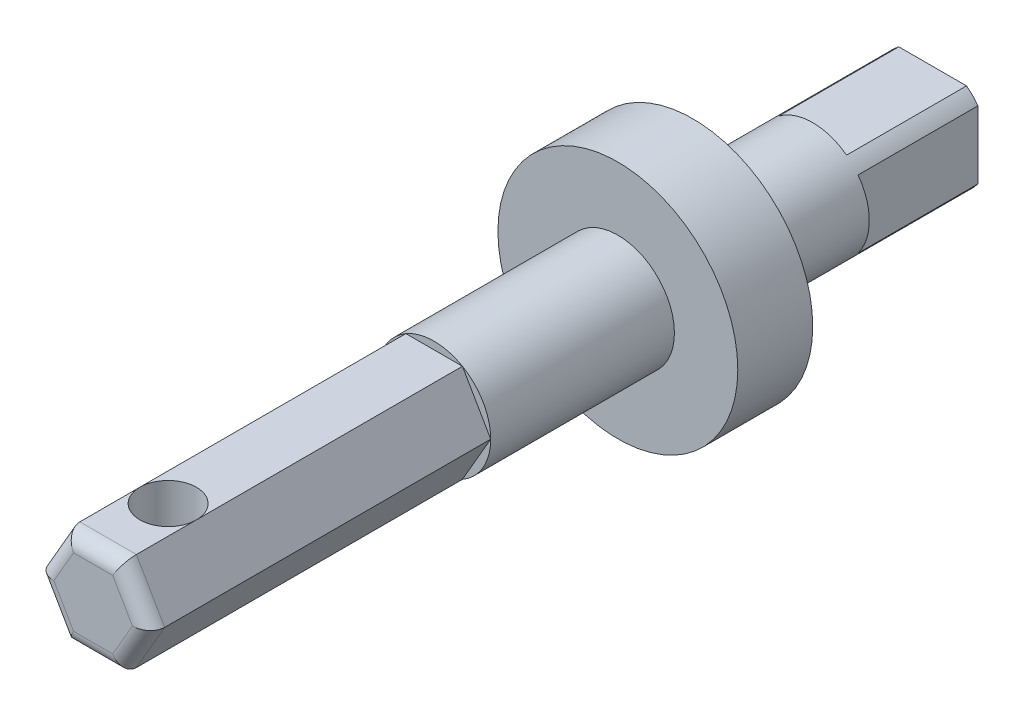
ISO-10303-21;
HEADER;
FILE_DESCRIPTION(('STEP AP214'),'2;1');
FILE_NAME('part.step','',(''),(''),'','','');
FILE_SCHEMA(('AUTOMOTIVE_DESIGN { 1 0 10303 214 1 1 1 1 }'));
ENDSEC;
DATA;
#1=APPLICATION_CONTEXT('core data for automotive mechanical design processes');
#2=APPLICATION_PROTOCOL_DEFINITION('international standard','automotive_design',2000,#1);
#3=PRODUCT_CONTEXT('',#1,'mechanical');
#4=PRODUCT('Part','Part','',(#3));
#5=PRODUCT_RELATED_PRODUCT_CATEGORY('part','',(#4));
#6=PRODUCT_DEFINITION_FORMATION('','',#4);
#7=PRODUCT_DEFINITION_CONTEXT('part definition',#1,'design');
#8=PRODUCT_DEFINITION('design','',#6,#7);
#9=PRODUCT_DEFINITION_SHAPE('','',#8);
#10=(LENGTH_UNIT() NAMED_UNIT(*) SI_UNIT(.MILLI.,.METRE.));
#11=(NAMED_UNIT(*) PLANE_ANGLE_UNIT() SI_UNIT($,.RADIAN.));
#12=(NAMED_UNIT(*) SI_UNIT($,.STERADIAN.) SOLID_ANGLE_UNIT());
#13=UNCERTAINTY_MEASURE_WITH_UNIT(LENGTH_MEASURE(1.E-05),#10,'distance_accuracy_value','');
#14=(GEOMETRIC_REPRESENTATION_CONTEXT(3) GLOBAL_UNCERTAINTY_ASSIGNED_CONTEXT((#13)) GLOBAL_UNIT_ASSIGNED_CONTEXT((#10,
#11,#12)) REPRESENTATION_CONTEXT('',''));
#15=CARTESIAN_POINT('',(0.,0.,0.));
#16=DIRECTION('',(0.,0.,1.));
#17=DIRECTION('',(1.,0.,0.));
#18=AXIS2_PLACEMENT_3D('',#15,#16,#17);
#19=CARTESIAN_POINT('',(1.8865,3.26751384847869,46.));
#20=DIRECTION('',(0.,-1.,0.));
#21=DIRECTION('',(1.,0.,0.));
#22=AXIS2_PLACEMENT_3D('',#19,#20,#21);
#23=PLANE('',#22);
#24=DIRECTION('',(0.,0.,-1.));
#25=VECTOR('',#24,1.);
#26=CARTESIAN_POINT('',(-1.8865,3.26751384847869,46.));
#27=LINE('',#26,#25);
#28=CARTESIAN_POINT('',(-1.8865,3.26751384847869,55.));
#29=VERTEX_POINT('',#28);
#30=CARTESIAN_POINT('',(-1.8865,3.26751384847869,51.));
#31=VERTEX_POINT('',#30);
#32=EDGE_CURVE('E176',#29,#31,#27,.T.);
#33=ORIENTED_EDGE('',*,*,#32,.F.);
#34=DIRECTION('',(-1.,0.,0.));
#35=VECTOR('',#34,1.);
#36=CARTESIAN_POINT('',(1.8865,3.26751384847869,55.));
#37=LINE('',#36,#35);
#38=CARTESIAN_POINT('',(1.8865,3.26751384847869,55.));
#39=VERTEX_POINT('',#38);
#40=EDGE_CURVE('E70',#29,#39,#37,.F.);
#41=ORIENTED_EDGE('',*,*,#40,.T.);
#42=DIRECTION('',(0.,0.,-1.));
#43=VECTOR('',#42,1.);
#44=CARTESIAN_POINT('',(1.8865,3.26751384847869,46.));
#45=LINE('',#44,#43);
#46=CARTESIAN_POINT('',(1.8865,3.26751384847869,51.));
#47=VERTEX_POINT('',#46);
#48=EDGE_CURVE('E201',#39,#47,#45,.T.);
#49=ORIENTED_EDGE('',*,*,#48,.T.);
#50=CARTESIAN_POINT('',(0.,3.26751384847869,51.));
#51=DIRECTION('',(0.,1.,0.));
#52=DIRECTION('',(-1.,0.,0.));
#53=AXIS2_PLACEMENT_3D('',#50,#51,#52);
#54=CIRCLE('',#53,1.8865);
#55=EDGE_CURVE('E196',#31,#47,#54,.T.);
#56=ORIENTED_EDGE('',*,*,#55,.F.);
#57=EDGE_LOOP('',(#33,#41,#49,#56));
#58=FACE_BOUND('',#57,.T.);
#59=ADVANCED_FACE('F45',(#58),#23,.F.);
#60=CARTESIAN_POINT('',(-1.8865,-3.26751384847869,46.));
#61=DIRECTION('',(0.,1.,0.));
#62=DIRECTION('',(-1.,0.,0.));
#63=AXIS2_PLACEMENT_3D('',#60,#61,#62);
#64=PLANE('',#63);
#65=DIRECTION('',(0.,0.,-1.));
#66=VECTOR('',#65,1.);
#67=CARTESIAN_POINT('',(1.8865,-3.26751384847869,46.));
#68=LINE('',#67,#66);
#69=CARTESIAN_POINT('',(1.8865,-3.26751384847869,55.));
#70=VERTEX_POINT('',#69);
#71=CARTESIAN_POINT('',(1.8865,-3.26751384847869,51.));
#72=VERTEX_POINT('',#71);
#73=EDGE_CURVE('E384',#70,#72,#68,.T.);
#74=ORIENTED_EDGE('',*,*,#73,.F.);
#75=DIRECTION('',(1.,0.,0.));
#76=VECTOR('',#75,1.);
#77=CARTESIAN_POINT('',(-1.8865,-3.26751384847869,55.));
#78=LINE('',#77,#76);
#79=CARTESIAN_POINT('',(-1.8865,-3.26751384847869,55.));
#80=VERTEX_POINT('',#79);
#81=EDGE_CURVE('E333',#70,#80,#78,.F.);
#82=ORIENTED_EDGE('',*,*,#81,.T.);
#83=DIRECTION('',(0.,0.,-1.));
#84=VECTOR('',#83,1.);
#85=CARTESIAN_POINT('',(-1.8865,-3.26751384847869,46.));
#86=LINE('',#85,#84);
#87=CARTESIAN_POINT('',(-1.8865,-3.26751384847869,51.));
#88=VERTEX_POINT('',#87);
#89=EDGE_CURVE('E211',#80,#88,#86,.T.);
#90=ORIENTED_EDGE('',*,*,#89,.T.);
#91=CARTESIAN_POINT('',(0.,-3.26751384847869,51.));
#92=DIRECTION('',(0.,1.,0.));
#93=DIRECTION('',(-1.,0.,0.));
#94=AXIS2_PLACEMENT_3D('',#91,#92,#93);
#95=CIRCLE('',#94,1.8865);
#96=EDGE_CURVE('E394',#88,#72,#95,.T.);
#97=ORIENTED_EDGE('',*,*,#96,.T.);
#98=EDGE_LOOP('',(#74,#82,#90,#97));
#99=FACE_BOUND('',#98,.T.);
#100=ADVANCED_FACE('F391',(#99),#64,.F.);
#101=CARTESIAN_POINT('',(0.,0.,8.25));
#102=DIRECTION('',(0.,0.,-1.));
#103=DIRECTION('',(-1.,0.,0.));
#104=AXIS2_PLACEMENT_3D('',#101,#102,#103);
#105=CYLINDRICAL_SURFACE('',#104,3.773);
#106=CARTESIAN_POINT('',(0.,0.,8.));
#107=DIRECTION('',(0.,0.,1.));
#108=DIRECTION('',(1.,0.,0.));
#109=AXIS2_PLACEMENT_3D('',#106,#107,#108);
#110=CIRCLE('',#109,3.773);
#111=CARTESIAN_POINT('',(3.023,-2.25765364925624,8.));
#112=VERTEX_POINT('',#111);
#113=CARTESIAN_POINT('',(3.023,2.25765364925624,8.));
#114=VERTEX_POINT('',#113);
#115=EDGE_CURVE('E217',#112,#114,#110,.T.);
#116=ORIENTED_EDGE('',*,*,#115,.T.);
#117=DIRECTION('',(0.,0.,-1.));
#118=VECTOR('',#117,1.);
#119=CARTESIAN_POINT('',(3.023,2.25765364925624,8.25));
#120=LINE('',#119,#118);
#121=CARTESIAN_POINT('',(3.023,2.25765364925624,0.));
#122=VERTEX_POINT('',#121);
#123=EDGE_CURVE('E284',#114,#122,#120,.T.);
#124=ORIENTED_EDGE('',*,*,#123,.T.);
#125=CARTESIAN_POINT('',(0.,0.,0.));
#126=DIRECTION('',(0.,0.,1.));
#127=DIRECTION('',(1.,0.,0.));
#128=AXIS2_PLACEMENT_3D('',#125,#126,#127);
#129=CIRCLE('',#128,3.773);
#130=CARTESIAN_POINT('',(2.25765364925624,3.023,0.));
#131=VERTEX_POINT('',#130);
#132=EDGE_CURVE('E268',#122,#131,#129,.T.);
#133=ORIENTED_EDGE('',*,*,#132,.T.);
#134=DIRECTION('',(0.,0.,-1.));
#135=VECTOR('',#134,1.);
#136=CARTESIAN_POINT('',(2.25765364925624,3.023,8.25));
#137=LINE('',#136,#135);
#138=CARTESIAN_POINT('',(2.25765364925624,3.023,8.));
#139=VERTEX_POINT('',#138);
#140=EDGE_CURVE('E293',#139,#131,#137,.T.);
#141=ORIENTED_EDGE('',*,*,#140,.F.);
#142=CARTESIAN_POINT('',(-2.25765364925624,3.023,8.));
#143=VERTEX_POINT('',#142);
#144=EDGE_CURVE('E221',#139,#143,#110,.T.);
#145=ORIENTED_EDGE('',*,*,#144,.T.);
#146=DIRECTION('',(0.,0.,-1.));
#147=VECTOR('',#146,1.);
#148=CARTESIAN_POINT('',(-2.25765364925624,3.023,8.25));
#149=LINE('',#148,#147);
#150=CARTESIAN_POINT('',(-2.25765364925624,3.023,0.));
#151=VERTEX_POINT('',#150);
#152=EDGE_CURVE('E290',#143,#151,#149,.T.);
#153=ORIENTED_EDGE('',*,*,#152,.T.);
#154=CARTESIAN_POINT('',(0.,0.,0.));
#155=DIRECTION('',(0.,0.,1.));
#156=DIRECTION('',(1.,0.,0.));
#157=AXIS2_PLACEMENT_3D('',#154,#155,#156);
#158=CIRCLE('',#157,3.773);
#159=CARTESIAN_POINT('',(3.023,-2.25765364925624,0.));
#160=VERTEX_POINT('',#159);
#161=EDGE_CURVE('E276',#151,#160,#158,.T.);
#162=ORIENTED_EDGE('',*,*,#161,.T.);
#163=DIRECTION('',(0.,0.,-1.));
#164=VECTOR('',#163,1.);
#165=CARTESIAN_POINT('',(3.023,-2.25765364925624,8.25));
#166=LINE('',#165,#164);
#167=EDGE_CURVE('E287',#112,#160,#166,.T.);
#168=ORIENTED_EDGE('',*,*,#167,.F.);
#169=EDGE_LOOP('',(#116,#124,#133,#141,#145,#153,#162,#168));
#170=FACE_BOUND('',#169,.T.);
#171=CARTESIAN_POINT('',(0.,0.,16.));
#172=DIRECTION('',(0.,0.,1.));
#173=DIRECTION('',(1.,0.,0.));
#174=AXIS2_PLACEMENT_3D('',#171,#172,#173);
#175=CIRCLE('',#174,3.773);
#176=CARTESIAN_POINT('',(3.773,0.,16.));
#177=VERTEX_POINT('',#176);
#178=EDGE_CURVE('E304',#177,#177,#175,.T.);
#179=ORIENTED_EDGE('',*,*,#178,.F.);
#180=EDGE_LOOP('',(#179));
#181=FACE_BOUND('',#180,.T.);
#182=ADVANCED_FACE('F490',(#170,#181),#105,.T.);
#183=CARTESIAN_POINT('',(-2.25765364925624,3.023,8.25));
#184=DIRECTION('',(0.,-1.,0.));
#185=DIRECTION('',(0.,0.,-1.));
#186=AXIS2_PLACEMENT_3D('',#183,#184,#185);
#187=PLANE('',#186);
#188=DIRECTION('',(-1.,0.,0.));
#189=VECTOR('',#188,1.);
#190=CARTESIAN_POINT('',(-2.25765364925624,3.023,8.));
#191=LINE('',#190,#189);
#192=EDGE_CURVE('E237',#139,#143,#191,.T.);
#193=ORIENTED_EDGE('',*,*,#192,.F.);
#194=ORIENTED_EDGE('',*,*,#140,.T.);
#195=DIRECTION('',(-1.,0.,0.));
#196=VECTOR('',#195,1.);
#197=CARTESIAN_POINT('',(-2.25765364925624,3.023,0.));
#198=LINE('',#197,#196);
#199=EDGE_CURVE('E272',#131,#151,#198,.T.);
#200=ORIENTED_EDGE('',*,*,#199,.T.);
#201=ORIENTED_EDGE('',*,*,#152,.F.);
#202=EDGE_LOOP('',(#193,#194,#200,#201));
#203=FACE_BOUND('',#202,.T.);
#204=ADVANCED_FACE('F495',(#203),#187,.F.);
#205=CARTESIAN_POINT('',(3.023,-2.25765364925624,8.25));
#206=DIRECTION('',(-1.,0.,0.));
#207=DIRECTION('',(0.,0.,1.));
#208=AXIS2_PLACEMENT_3D('',#205,#206,#207);
#209=PLANE('',#208);
#210=DIRECTION('',(0.,1.,0.));
#211=VECTOR('',#210,1.);
#212=CARTESIAN_POINT('',(3.023,-2.25765364925624,8.));
#213=LINE('',#212,#211);
#214=EDGE_CURVE('E234',#112,#114,#213,.T.);
#215=ORIENTED_EDGE('',*,*,#214,.F.);
#216=ORIENTED_EDGE('',*,*,#167,.T.);
#217=DIRECTION('',(0.,1.,0.));
#218=VECTOR('',#217,1.);
#219=CARTESIAN_POINT('',(3.023,-2.25765364925624,0.));
#220=LINE('',#219,#218);
#221=EDGE_CURVE('E280',#160,#122,#220,.T.);
#222=ORIENTED_EDGE('',*,*,#221,.T.);
#223=ORIENTED_EDGE('',*,*,#123,.F.);
#224=EDGE_LOOP('',(#215,#216,#222,#223));
#225=FACE_BOUND('',#224,.T.);
#226=ADVANCED_FACE('F507',(#225),#209,.F.);
#227=CARTESIAN_POINT('',(0.,0.,8.25));
#228=DIRECTION('',(0.,0.,-1.));
#229=DIRECTION('',(-1.,0.,0.));
#230=AXIS2_PLACEMENT_3D('',#227,#228,#229);
#231=CYLINDRICAL_SURFACE('',#230,2.9);
#232=DIRECTION('',(0.,0.,-1.));
#233=VECTOR('',#232,1.);
#234=CARTESIAN_POINT('',(-2.89269622273741,-0.205690454228533,8.25));
#235=LINE('',#234,#233);
#236=CARTESIAN_POINT('',(-2.89269622273741,-0.205690454228533,8.));
#237=VERTEX_POINT('',#236);
#238=CARTESIAN_POINT('',(-2.89269622273741,-0.205690454228533,0.));
#239=VERTEX_POINT('',#238);
#240=EDGE_CURVE('E256',#237,#239,#235,.T.);
#241=ORIENTED_EDGE('',*,*,#240,.F.);
#242=CARTESIAN_POINT('',(0.,0.,8.));
#243=DIRECTION('',(0.,0.,1.));
#244=DIRECTION('',(1.,0.,0.));
#245=AXIS2_PLACEMENT_3D('',#242,#243,#244);
#246=CIRCLE('',#245,2.9);
#247=CARTESIAN_POINT('',(-0.20569045422852,-2.89269622273741,8.));
#248=VERTEX_POINT('',#247);
#249=EDGE_CURVE('E230',#237,#248,#246,.T.);
#250=ORIENTED_EDGE('',*,*,#249,.T.);
#251=DIRECTION('',(0.,0.,-1.));
#252=VECTOR('',#251,1.);
#253=CARTESIAN_POINT('',(-0.20569045422852,-2.89269622273741,8.25));
#254=LINE('',#253,#252);
#255=CARTESIAN_POINT('',(-0.20569045422852,-2.89269622273741,0.));
#256=VERTEX_POINT('',#255);
#257=EDGE_CURVE('E265',#248,#256,#254,.T.);
#258=ORIENTED_EDGE('',*,*,#257,.T.);
#259=CARTESIAN_POINT('',(0.,0.,0.));
#260=DIRECTION('',(0.,0.,1.));
#261=DIRECTION('',(1.,0.,0.));
#262=AXIS2_PLACEMENT_3D('',#259,#260,#261);
#263=CIRCLE('',#262,2.9);
#264=EDGE_CURVE('E240',#239,#256,#263,.T.);
#265=ORIENTED_EDGE('',*,*,#264,.F.);
#266=EDGE_LOOP('',(#241,#250,#258,#265));
#267=FACE_BOUND('',#266,.T.);
#268=ADVANCED_FACE('F766',(#267),#231,.F.);
#269=CARTESIAN_POINT('',(-0.20569045422852,-2.89269622273741,8.25));
#270=DIRECTION('',(-0.707106781186549,0.707106781186546,0.));
#271=DIRECTION('',(-0.707106781186546,-0.707106781186549,0.));
#272=AXIS2_PLACEMENT_3D('',#269,#270,#271);
#273=PLANE('',#272);
#274=ORIENTED_EDGE('',*,*,#257,.F.);
#275=DIRECTION('',(0.707106781186546,0.707106781186549,0.));
#276=VECTOR('',#275,1.);
#277=CARTESIAN_POINT('',(-0.20569045422852,-2.89269622273741,8.));
#278=LINE('',#277,#276);
#279=CARTESIAN_POINT('',(2.89269622273741,0.205690454228532,8.));
#280=VERTEX_POINT('',#279);
#281=EDGE_CURVE('E226',#248,#280,#278,.T.);
#282=ORIENTED_EDGE('',*,*,#281,.T.);
#283=DIRECTION('',(0.,0.,-1.));
#284=VECTOR('',#283,1.);
#285=CARTESIAN_POINT('',(2.89269622273741,0.205690454228532,8.25));
#286=LINE('',#285,#284);
#287=CARTESIAN_POINT('',(2.89269622273741,0.205690454228532,0.));
#288=VERTEX_POINT('',#287);
#289=EDGE_CURVE('E262',#280,#288,#286,.T.);
#290=ORIENTED_EDGE('',*,*,#289,.T.);
#291=DIRECTION('',(0.707106781186546,0.707106781186549,0.));
#292=VECTOR('',#291,1.);
#293=CARTESIAN_POINT('',(-0.20569045422852,-2.89269622273741,0.));
#294=LINE('',#293,#292);
#295=EDGE_CURVE('E244',#256,#288,#294,.T.);
#296=ORIENTED_EDGE('',*,*,#295,.F.);
#297=EDGE_LOOP('',(#274,#282,#290,#296));
#298=FACE_BOUND('',#297,.T.);
#299=ADVANCED_FACE('F776',(#298),#273,.T.);
#300=CARTESIAN_POINT('',(0.,0.,8.25));
#301=DIRECTION('',(0.,0.,-1.));
#302=DIRECTION('',(-1.,0.,0.));
#303=AXIS2_PLACEMENT_3D('',#300,#301,#302);
#304=CYLINDRICAL_SURFACE('',#303,2.9);
#305=ORIENTED_EDGE('',*,*,#289,.F.);
#306=CARTESIAN_POINT('',(0.,0.,8.));
#307=DIRECTION('',(0.,0.,1.));
#308=DIRECTION('',(1.,0.,0.));
#309=AXIS2_PLACEMENT_3D('',#306,#307,#308);
#310=CIRCLE('',#309,2.9);
#311=CARTESIAN_POINT('',(0.205690454228521,2.89269622273741,8.));
#312=VERTEX_POINT('',#311);
#313=EDGE_CURVE('E222',#280,#312,#310,.T.);
#314=ORIENTED_EDGE('',*,*,#313,.T.);
#315=DIRECTION('',(0.,0.,-1.));
#316=VECTOR('',#315,1.);
#317=CARTESIAN_POINT('',(0.20569045422852,2.89269622273741,8.25));
#318=LINE('',#317,#316);
#319=CARTESIAN_POINT('',(0.20569045422852,2.89269622273741,0.));
#320=VERTEX_POINT('',#319);
#321=EDGE_CURVE('E259',#312,#320,#318,.T.);
#322=ORIENTED_EDGE('',*,*,#321,.T.);
#323=CARTESIAN_POINT('',(0.,0.,0.));
#324=DIRECTION('',(0.,0.,1.));
#325=DIRECTION('',(1.,0.,0.));
#326=AXIS2_PLACEMENT_3D('',#323,#324,#325);
#327=CIRCLE('',#326,2.9);
#328=EDGE_CURVE('E248',#288,#320,#327,.T.);
#329=ORIENTED_EDGE('',*,*,#328,.F.);
#330=EDGE_LOOP('',(#305,#314,#322,#329));
#331=FACE_BOUND('',#330,.T.);
#332=ADVANCED_FACE('F786',(#331),#304,.F.);
#333=CARTESIAN_POINT('',(-2.89269622273741,-0.205690454228533,8.25));
#334=DIRECTION('',(0.707106781186549,-0.707106781186546,0.));
#335=DIRECTION('',(0.707106781186546,0.707106781186549,0.));
#336=AXIS2_PLACEMENT_3D('',#333,#334,#335);
#337=PLANE('',#336);
#338=ORIENTED_EDGE('',*,*,#321,.F.);
#339=DIRECTION('',(-0.707106781186546,-0.707106781186549,0.));
#340=VECTOR('',#339,1.);
#341=CARTESIAN_POINT('',(-2.89269622273741,-0.205690454228533,8.));
#342=LINE('',#341,#340);
#343=EDGE_CURVE('E296',#312,#237,#342,.T.);
#344=ORIENTED_EDGE('',*,*,#343,.T.);
#345=ORIENTED_EDGE('',*,*,#240,.T.);
#346=DIRECTION('',(-0.707106781186546,-0.707106781186549,0.));
#347=VECTOR('',#346,1.);
#348=CARTESIAN_POINT('',(-2.89269622273741,-0.205690454228533,0.));
#349=LINE('',#348,#347);
#350=EDGE_CURVE('E252',#320,#239,#349,.T.);
#351=ORIENTED_EDGE('',*,*,#350,.F.);
#352=EDGE_LOOP('',(#338,#344,#345,#351));
#353=FACE_BOUND('',#352,.T.);
#354=ADVANCED_FACE('F796',(#353),#337,.T.);
#355=CARTESIAN_POINT('',(0.,0.,0.));
#356=DIRECTION('',(0.,0.,1.));
#357=DIRECTION('',(1.,0.,0.));
#358=AXIS2_PLACEMENT_3D('',#355,#356,#357);
#359=PLANE('',#358);
#360=ORIENTED_EDGE('',*,*,#132,.F.);
#361=ORIENTED_EDGE('',*,*,#221,.F.);
#362=ORIENTED_EDGE('',*,*,#161,.F.);
#363=ORIENTED_EDGE('',*,*,#199,.F.);
#364=EDGE_LOOP('',(#360,#361,#362,#363));
#365=FACE_BOUND('',#364,.T.);
#366=ORIENTED_EDGE('',*,*,#264,.T.);
#367=ORIENTED_EDGE('',*,*,#295,.T.);
#368=ORIENTED_EDGE('',*,*,#328,.T.);
#369=ORIENTED_EDGE('',*,*,#350,.T.);
#370=EDGE_LOOP('',(#366,#367,#368,#369));
#371=FACE_BOUND('',#370,.T.);
#372=ADVANCED_FACE('F501',(#365,#371),#359,.F.);
#373=CARTESIAN_POINT('',(0.,0.,8.));
#374=DIRECTION('',(0.,0.,1.));
#375=DIRECTION('',(1.,0.,0.));
#376=AXIS2_PLACEMENT_3D('',#373,#374,#375);
#377=PLANE('',#376);
#378=ORIENTED_EDGE('',*,*,#249,.F.);
#379=ORIENTED_EDGE('',*,*,#343,.F.);
#380=ORIENTED_EDGE('',*,*,#313,.F.);
#381=ORIENTED_EDGE('',*,*,#281,.F.);
#382=EDGE_LOOP('',(#378,#379,#380,#381));
#383=FACE_BOUND('',#382,.T.);
#384=ADVANCED_FACE('F512',(#383),#377,.F.);
#385=ORIENTED_EDGE('',*,*,#115,.F.);
#386=ORIENTED_EDGE('',*,*,#214,.T.);
#387=EDGE_LOOP('',(#385,#386));
#388=FACE_BOUND('',#387,.T.);
#389=ADVANCED_FACE('F509',(#388),#377,.F.);
#390=ORIENTED_EDGE('',*,*,#144,.F.);
#391=ORIENTED_EDGE('',*,*,#192,.T.);
#392=EDGE_LOOP('',(#390,#391));
#393=FACE_BOUND('',#392,.T.);
#394=ADVANCED_FACE('F511',(#393),#377,.F.);
#395=CARTESIAN_POINT('',(0.,0.,16.));
#396=DIRECTION('',(0.,0.,1.));
#397=DIRECTION('',(1.,0.,0.));
#398=AXIS2_PLACEMENT_3D('',#395,#396,#397);
#399=CYLINDRICAL_SURFACE('',#398,8.);
#400=CARTESIAN_POINT('',(0.,0.,16.));
#401=DIRECTION('',(0.,0.,1.));
#402=DIRECTION('',(1.,0.,0.));
#403=AXIS2_PLACEMENT_3D('',#400,#401,#402);
#404=CIRCLE('',#403,8.);
#405=CARTESIAN_POINT('',(8.,0.,16.));
#406=VERTEX_POINT('',#405);
#407=EDGE_CURVE('E310',#406,#406,#404,.T.);
#408=ORIENTED_EDGE('',*,*,#407,.T.);
#409=EDGE_LOOP('',(#408));
#410=FACE_BOUND('',#409,.T.);
#411=CARTESIAN_POINT('',(0.,0.,21.));
#412=DIRECTION('',(0.,0.,1.));
#413=DIRECTION('',(1.,0.,0.));
#414=AXIS2_PLACEMENT_3D('',#411,#412,#413);
#415=CIRCLE('',#414,8.);
#416=CARTESIAN_POINT('',(8.,0.,21.));
#417=VERTEX_POINT('',#416);
#418=EDGE_CURVE('E464',#417,#417,#415,.T.);
#419=ORIENTED_EDGE('',*,*,#418,.F.);
#420=EDGE_LOOP('',(#419));
#421=FACE_BOUND('',#420,.T.);
#422=ADVANCED_FACE('F518',(#410,#421),#399,.T.);
#423=CARTESIAN_POINT('',(0.,0.,16.));
#424=DIRECTION('',(0.,0.,1.));
#425=DIRECTION('',(1.,0.,0.));
#426=AXIS2_PLACEMENT_3D('',#423,#424,#425);
#427=PLANE('',#426);
#428=ORIENTED_EDGE('',*,*,#178,.T.);
#429=EDGE_LOOP('',(#428));
#430=FACE_BOUND('',#429,.T.);
#431=ORIENTED_EDGE('',*,*,#407,.F.);
#432=EDGE_LOOP('',(#431));
#433=FACE_BOUND('',#432,.T.);
#434=ADVANCED_FACE('F547',(#430,#433),#427,.F.);
#435=CARTESIAN_POINT('',(0.,0.,21.));
#436=DIRECTION('',(0.,0.,1.));
#437=DIRECTION('',(1.,0.,0.));
#438=AXIS2_PLACEMENT_3D('',#435,#436,#437);
#439=PLANE('',#438);
#440=CARTESIAN_POINT('',(0.,0.,21.));
#441=DIRECTION('',(0.,0.,1.));
#442=DIRECTION('',(1.,0.,0.));
#443=AXIS2_PLACEMENT_3D('',#440,#441,#442);
#444=CIRCLE('',#443,3.773);
#445=CARTESIAN_POINT('',(3.773,0.,21.));
#446=VERTEX_POINT('',#445);
#447=EDGE_CURVE('E305',#446,#446,#444,.T.);
#448=ORIENTED_EDGE('',*,*,#447,.F.);
#449=EDGE_LOOP('',(#448));
#450=FACE_BOUND('',#449,.T.);
#451=ORIENTED_EDGE('',*,*,#418,.T.);
#452=EDGE_LOOP('',(#451));
#453=FACE_BOUND('',#452,.T.);
#454=ADVANCED_FACE('F541',(#450,#453),#439,.T.);
#455=CARTESIAN_POINT('',(0.,0.,56.));
#456=DIRECTION('',(0.,0.,1.));
#457=DIRECTION('',(1.,0.,0.));
#458=AXIS2_PLACEMENT_3D('',#455,#456,#457);
#459=PLANE('',#458);
#460=DIRECTION('',(0.5,-0.866025403784439,0.));
#461=VECTOR('',#460,1.);
#462=CARTESIAN_POINT('',(-1.02047459621556,-2.76751384847869,56.));
#463=LINE('',#462,#461);
#464=CARTESIAN_POINT('',(-2.61829946162075,0.,56.));
#465=VERTEX_POINT('',#464);
#466=CARTESIAN_POINT('',(-1.30914973081037,-2.26751384847869,56.));
#467=VERTEX_POINT('',#466);
#468=EDGE_CURVE('E326',#465,#467,#463,.T.);
#469=ORIENTED_EDGE('',*,*,#468,.T.);
#470=DIRECTION('',(1.,0.,0.));
#471=VECTOR('',#470,1.);
#472=CARTESIAN_POINT('',(1.8865,-2.26751384847869,56.));
#473=LINE('',#472,#471);
#474=CARTESIAN_POINT('',(1.30914973081037,-2.26751384847869,56.));
#475=VERTEX_POINT('',#474);
#476=EDGE_CURVE('E329',#467,#475,#473,.T.);
#477=ORIENTED_EDGE('',*,*,#476,.T.);
#478=DIRECTION('',(0.5,0.866025403784439,0.));
#479=VECTOR('',#478,1.);
#480=CARTESIAN_POINT('',(2.90697459621556,0.500000000000002,56.));
#481=LINE('',#480,#479);
#482=CARTESIAN_POINT('',(2.61829946162075,0.,56.));
#483=VERTEX_POINT('',#482);
#484=EDGE_CURVE('E314',#475,#483,#481,.T.);
#485=ORIENTED_EDGE('',*,*,#484,.T.);
#486=DIRECTION('',(-0.5,0.866025403784439,0.));
#487=VECTOR('',#486,1.);
#488=CARTESIAN_POINT('',(1.02047459621556,2.76751384847869,56.));
#489=LINE('',#488,#487);
#490=CARTESIAN_POINT('',(1.30914973081037,2.26751384847869,56.));
#491=VERTEX_POINT('',#490);
#492=EDGE_CURVE('E317',#483,#491,#489,.T.);
#493=ORIENTED_EDGE('',*,*,#492,.T.);
#494=DIRECTION('',(-1.,0.,0.));
#495=VECTOR('',#494,1.);
#496=CARTESIAN_POINT('',(-1.8865,2.26751384847869,56.));
#497=LINE('',#496,#495);
#498=CARTESIAN_POINT('',(-1.30914973081037,2.26751384847869,56.));
#499=VERTEX_POINT('',#498);
#500=EDGE_CURVE('E320',#491,#499,#497,.T.);
#501=ORIENTED_EDGE('',*,*,#500,.T.);
#502=DIRECTION('',(-0.5,-0.866025403784439,0.));
#503=VECTOR('',#502,1.);
#504=CARTESIAN_POINT('',(-2.90697459621556,-0.500000000000001,56.));
#505=LINE('',#504,#503);
#506=EDGE_CURVE('E323',#499,#465,#505,.T.);
#507=ORIENTED_EDGE('',*,*,#506,.T.);
#508=EDGE_LOOP('',(#469,#477,#485,#493,#501,#507));
#509=FACE_BOUND('',#508,.T.);
#510=ADVANCED_FACE('F537',(#509),#459,.T.);
#511=CARTESIAN_POINT('',(3.773,0.,46.));
#512=DIRECTION('',(-0.866025403784438,-0.5,0.));
#513=DIRECTION('',(0.5,-0.866025403784439,0.));
#514=AXIS2_PLACEMENT_3D('',#511,#512,#513);
#515=PLANE('',#514);
#516=ORIENTED_EDGE('',*,*,#48,.F.);
#517=DIRECTION('',(-0.5,0.866025403784439,0.));
#518=VECTOR('',#517,1.);
#519=CARTESIAN_POINT('',(3.773,0.,55.));
#520=LINE('',#519,#518);
#521=CARTESIAN_POINT('',(3.773,0.,55.));
#522=VERTEX_POINT('',#521);
#523=EDGE_CURVE('E55',#39,#522,#520,.F.);
#524=ORIENTED_EDGE('',*,*,#523,.T.);
#525=DIRECTION('',(0.,0.,-1.));
#526=VECTOR('',#525,1.);
#527=CARTESIAN_POINT('',(3.773,0.,46.));
#528=LINE('',#527,#526);
#529=CARTESIAN_POINT('',(3.773,0.,33.254));
#530=VERTEX_POINT('',#529);
#531=EDGE_CURVE('E387',#522,#530,#528,.T.);
#532=ORIENTED_EDGE('',*,*,#531,.T.);
#533=DIRECTION('',(-0.5,0.866025403784439,0.));
#534=VECTOR('',#533,1.);
#535=CARTESIAN_POINT('',(3.773,0.,33.254));
#536=LINE('',#535,#534);
#537=CARTESIAN_POINT('',(1.8865,3.26751384847869,33.254));
#538=VERTEX_POINT('',#537);
#539=EDGE_CURVE('E300',#530,#538,#536,.T.);
#540=ORIENTED_EDGE('',*,*,#539,.T.);
#541=EDGE_CURVE('E188',#47,#538,#45,.T.);
#542=ORIENTED_EDGE('',*,*,#541,.F.);
#543=EDGE_LOOP('',(#516,#524,#532,#540,#542));
#544=FACE_BOUND('',#543,.T.);
#545=ADVANCED_FACE('F483',(#544),#515,.F.);
#546=CARTESIAN_POINT('',(-1.8865,3.26751384847869,33.254));
#547=VERTEX_POINT('',#546);
#548=EDGE_CURVE('E182',#31,#547,#27,.T.);
#549=ORIENTED_EDGE('',*,*,#548,.F.);
#550=EDGE_CURVE('E193',#47,#31,#54,.T.);
#551=ORIENTED_EDGE('',*,*,#550,.F.);
#552=ORIENTED_EDGE('',*,*,#541,.T.);
#553=DIRECTION('',(-1.,0.,0.));
#554=VECTOR('',#553,1.);
#555=CARTESIAN_POINT('',(1.8865,3.26751384847869,33.254));
#556=LINE('',#555,#554);
#557=EDGE_CURVE('E207',#538,#547,#556,.T.);
#558=ORIENTED_EDGE('',*,*,#557,.T.);
#559=EDGE_LOOP('',(#549,#551,#552,#558));
#560=FACE_BOUND('',#559,.T.);
#561=ADVANCED_FACE('F205',(#560),#23,.F.);
#562=CARTESIAN_POINT('',(-1.8865,3.26751384847869,46.));
#563=DIRECTION('',(0.866025403784439,-0.5,0.));
#564=DIRECTION('',(0.5,0.866025403784439,0.));
#565=AXIS2_PLACEMENT_3D('',#562,#563,#564);
#566=PLANE('',#565);
#567=DIRECTION('',(0.,0.,-1.));
#568=VECTOR('',#567,1.);
#569=CARTESIAN_POINT('',(-3.773,0.,46.));
#570=LINE('',#569,#568);
#571=CARTESIAN_POINT('',(-3.773,0.,55.));
#572=VERTEX_POINT('',#571);
#573=CARTESIAN_POINT('',(-3.773,0.,33.254));
#574=VERTEX_POINT('',#573);
#575=EDGE_CURVE('E209',#572,#574,#570,.T.);
#576=ORIENTED_EDGE('',*,*,#575,.F.);
#577=DIRECTION('',(-0.5,-0.866025403784439,0.));
#578=VECTOR('',#577,1.);
#579=CARTESIAN_POINT('',(-1.8865,3.26751384847869,55.));
#580=LINE('',#579,#578);
#581=EDGE_CURVE('E185',#572,#29,#580,.F.);
#582=ORIENTED_EDGE('',*,*,#581,.T.);
#583=ORIENTED_EDGE('',*,*,#32,.T.);
#584=ORIENTED_EDGE('',*,*,#548,.T.);
#585=DIRECTION('',(-0.5,-0.866025403784439,0.));
#586=VECTOR('',#585,1.);
#587=CARTESIAN_POINT('',(-1.8865,3.26751384847869,33.254));
#588=LINE('',#587,#586);
#589=EDGE_CURVE('E413',#547,#574,#588,.T.);
#590=ORIENTED_EDGE('',*,*,#589,.T.);
#591=EDGE_LOOP('',(#576,#582,#583,#584,#590));
#592=FACE_BOUND('',#591,.T.);
#593=ADVANCED_FACE('F179',(#592),#566,.F.);
#594=CARTESIAN_POINT('',(-3.773,0.,46.));
#595=DIRECTION('',(0.866025403784438,0.5,0.));
#596=DIRECTION('',(-0.5,0.866025403784439,0.));
#597=AXIS2_PLACEMENT_3D('',#594,#595,#596);
#598=PLANE('',#597);
#599=ORIENTED_EDGE('',*,*,#89,.F.);
#600=DIRECTION('',(0.5,-0.866025403784439,0.));
#601=VECTOR('',#600,1.);
#602=CARTESIAN_POINT('',(-3.773,0.,55.));
#603=LINE('',#602,#601);
#604=EDGE_CURVE('E337',#80,#572,#603,.F.);
#605=ORIENTED_EDGE('',*,*,#604,.T.);
#606=ORIENTED_EDGE('',*,*,#575,.T.);
#607=DIRECTION('',(0.5,-0.866025403784439,0.));
#608=VECTOR('',#607,1.);
#609=CARTESIAN_POINT('',(-3.773,0.,33.254));
#610=LINE('',#609,#608);
#611=CARTESIAN_POINT('',(-1.8865,-3.26751384847869,33.254));
#612=VERTEX_POINT('',#611);
#613=EDGE_CURVE('E418',#574,#612,#610,.T.);
#614=ORIENTED_EDGE('',*,*,#613,.T.);
#615=EDGE_CURVE('E397',#88,#612,#86,.T.);
#616=ORIENTED_EDGE('',*,*,#615,.F.);
#617=EDGE_LOOP('',(#599,#605,#606,#614,#616));
#618=FACE_BOUND('',#617,.T.);
#619=ADVANCED_FACE('F409',(#618),#598,.F.);
#620=CARTESIAN_POINT('',(1.8865,-3.26751384847869,33.254));
#621=VERTEX_POINT('',#620);
#622=EDGE_CURVE('E398',#72,#621,#68,.T.);
#623=ORIENTED_EDGE('',*,*,#622,.F.);
#624=EDGE_CURVE('E203',#72,#88,#95,.T.);
#625=ORIENTED_EDGE('',*,*,#624,.T.);
#626=ORIENTED_EDGE('',*,*,#615,.T.);
#627=DIRECTION('',(1.,0.,0.));
#628=VECTOR('',#627,1.);
#629=CARTESIAN_POINT('',(-1.8865,-3.26751384847869,33.254));
#630=LINE('',#629,#628);
#631=EDGE_CURVE('E422',#612,#621,#630,.T.);
#632=ORIENTED_EDGE('',*,*,#631,.T.);
#633=EDGE_LOOP('',(#623,#625,#626,#632));
#634=FACE_BOUND('',#633,.T.);
#635=ADVANCED_FACE('F440',(#634),#64,.F.);
#636=CARTESIAN_POINT('',(1.8865,-3.26751384847869,46.));
#637=DIRECTION('',(-0.866025403784439,0.5,0.));
#638=DIRECTION('',(-0.5,-0.866025403784439,0.));
#639=AXIS2_PLACEMENT_3D('',#636,#637,#638);
#640=PLANE('',#639);
#641=ORIENTED_EDGE('',*,*,#531,.F.);
#642=DIRECTION('',(0.5,0.866025403784439,0.));
#643=VECTOR('',#642,1.);
#644=CARTESIAN_POINT('',(1.8865,-3.26751384847869,55.));
#645=LINE('',#644,#643);
#646=EDGE_CURVE('E11',#522,#70,#645,.F.);
#647=ORIENTED_EDGE('',*,*,#646,.T.);
#648=ORIENTED_EDGE('',*,*,#73,.T.);
#649=ORIENTED_EDGE('',*,*,#622,.T.);
#650=DIRECTION('',(0.5,0.866025403784439,0.));
#651=VECTOR('',#650,1.);
#652=CARTESIAN_POINT('',(1.8865,-3.26751384847869,33.254));
#653=LINE('',#652,#651);
#654=EDGE_CURVE('E431',#621,#530,#653,.T.);
#655=ORIENTED_EDGE('',*,*,#654,.T.);
#656=EDGE_LOOP('',(#641,#647,#648,#649,#655));
#657=FACE_BOUND('',#656,.T.);
#658=ADVANCED_FACE('F383',(#657),#640,.F.);
#659=CARTESIAN_POINT('',(0.,0.,33.254));
#660=DIRECTION('',(0.,0.,1.));
#661=DIRECTION('',(1.,0.,0.));
#662=AXIS2_PLACEMENT_3D('',#659,#660,#661);
#663=PLANE('',#662);
#664=ORIENTED_EDGE('',*,*,#539,.F.);
#665=CARTESIAN_POINT('',(0.,0.,33.254));
#666=DIRECTION('',(0.,0.,1.));
#667=DIRECTION('',(1.,0.,0.));
#668=AXIS2_PLACEMENT_3D('',#665,#666,#667);
#669=CIRCLE('',#668,3.773);
#670=EDGE_CURVE('E424',#530,#538,#669,.T.);
#671=ORIENTED_EDGE('',*,*,#670,.T.);
#672=EDGE_LOOP('',(#664,#671));
#673=FACE_BOUND('',#672,.T.);
#674=ADVANCED_FACE('F482',(#673),#663,.T.);
#675=ORIENTED_EDGE('',*,*,#557,.F.);
#676=EDGE_CURVE('E460',#538,#547,#669,.T.);
#677=ORIENTED_EDGE('',*,*,#676,.T.);
#678=EDGE_LOOP('',(#675,#677));
#679=FACE_BOUND('',#678,.T.);
#680=ADVANCED_FACE('F672',(#679),#663,.T.);
#681=ORIENTED_EDGE('',*,*,#589,.F.);
#682=EDGE_CURVE('E458',#547,#574,#669,.T.);
#683=ORIENTED_EDGE('',*,*,#682,.T.);
#684=EDGE_LOOP('',(#681,#683));
#685=FACE_BOUND('',#684,.T.);
#686=ADVANCED_FACE('F679',(#685),#663,.T.);
#687=ORIENTED_EDGE('',*,*,#613,.F.);
#688=EDGE_CURVE('E451',#574,#612,#669,.T.);
#689=ORIENTED_EDGE('',*,*,#688,.T.);
#690=EDGE_LOOP('',(#687,#689));
#691=FACE_BOUND('',#690,.T.);
#692=ADVANCED_FACE('F456',(#691),#663,.T.);
#693=ORIENTED_EDGE('',*,*,#631,.F.);
#694=EDGE_CURVE('E445',#612,#621,#669,.T.);
#695=ORIENTED_EDGE('',*,*,#694,.T.);
#696=EDGE_LOOP('',(#693,#695));
#697=FACE_BOUND('',#696,.T.);
#698=ADVANCED_FACE('F444',(#697),#663,.T.);
#699=ORIENTED_EDGE('',*,*,#654,.F.);
#700=EDGE_CURVE('E309',#621,#530,#669,.T.);
#701=ORIENTED_EDGE('',*,*,#700,.T.);
#702=EDGE_LOOP('',(#699,#701));
#703=FACE_BOUND('',#702,.T.);
#704=ADVANCED_FACE('F476',(#703),#663,.T.);
#705=ORIENTED_EDGE('',*,*,#447,.T.);
#706=EDGE_LOOP('',(#705));
#707=FACE_BOUND('',#706,.T.);
#708=ORIENTED_EDGE('',*,*,#700,.F.);
#709=ORIENTED_EDGE('',*,*,#694,.F.);
#710=ORIENTED_EDGE('',*,*,#688,.F.);
#711=ORIENTED_EDGE('',*,*,#682,.F.);
#712=ORIENTED_EDGE('',*,*,#676,.F.);
#713=ORIENTED_EDGE('',*,*,#670,.F.);
#714=EDGE_LOOP('',(#708,#709,#710,#711,#712,#713));
#715=FACE_BOUND('',#714,.T.);
#716=ADVANCED_FACE('F450',(#707,#715),#105,.T.);
#717=CARTESIAN_POINT('',(0.,-8.,51.));
#718=DIRECTION('',(0.,1.,0.));
#719=DIRECTION('',(-1.,0.,0.));
#720=AXIS2_PLACEMENT_3D('',#717,#718,#719);
#721=CYLINDRICAL_SURFACE('',#720,1.8865);
#722=ORIENTED_EDGE('',*,*,#55,.T.);
#723=ORIENTED_EDGE('',*,*,#550,.T.);
#724=EDGE_LOOP('',(#722,#723));
#725=FACE_BOUND('',#724,.T.);
#726=ORIENTED_EDGE('',*,*,#624,.F.);
#727=ORIENTED_EDGE('',*,*,#96,.F.);
#728=EDGE_LOOP('',(#726,#727));
#729=FACE_BOUND('',#728,.T.);
#730=ADVANCED_FACE('F194',(#725,#729),#721,.F.);
#731=CARTESIAN_POINT('',(0.,2.26751384847869,55.));
#732=DIRECTION('',(1.,0.,0.));
#733=DIRECTION('',(0.,1.,0.));
#734=AXIS2_PLACEMENT_3D('',#731,#732,#733);
#735=CYLINDRICAL_SURFACE('',#734,1.);
#736=CARTESIAN_POINT('',(1.30914973081037,2.26751384847869,55.));
#737=DIRECTION('',(0.866025403784439,-0.5,0.));
#738=DIRECTION('',(-0.5,-0.866025403784439,0.));
#739=AXIS2_PLACEMENT_3D('',#736,#737,#738);
#740=ELLIPSE('',#739,1.15470053837925,1.);
#741=EDGE_CURVE('E359',#39,#491,#740,.T.);
#742=ORIENTED_EDGE('',*,*,#741,.F.);
#743=ORIENTED_EDGE('',*,*,#40,.F.);
#744=CARTESIAN_POINT('',(-1.30914973081037,2.26751384847869,55.));
#745=DIRECTION('',(0.866025403784438,0.5,0.));
#746=DIRECTION('',(0.5,-0.866025403784438,0.));
#747=AXIS2_PLACEMENT_3D('',#744,#745,#746);
#748=ELLIPSE('',#747,1.15470053837925,1.);
#749=EDGE_CURVE('E49',#499,#29,#748,.F.);
#750=ORIENTED_EDGE('',*,*,#749,.F.);
#751=ORIENTED_EDGE('',*,*,#500,.F.);
#752=EDGE_LOOP('',(#742,#743,#750,#751));
#753=FACE_BOUND('',#752,.T.);
#754=ADVANCED_FACE('F47',(#753),#735,.T.);
#755=CARTESIAN_POINT('',(-1.96372459621556,1.13375692423934,55.));
#756=DIRECTION('',(0.5,0.866025403784439,0.));
#757=DIRECTION('',(-0.866025403784439,0.5,0.));
#758=AXIS2_PLACEMENT_3D('',#755,#756,#757);
#759=CYLINDRICAL_SURFACE('',#758,1.);
#760=ORIENTED_EDGE('',*,*,#749,.T.);
#761=ORIENTED_EDGE('',*,*,#581,.F.);
#762=CARTESIAN_POINT('',(-2.61829946162075,0.,55.));
#763=DIRECTION('',(0.,1.,0.));
#764=DIRECTION('',(1.,0.,0.));
#765=AXIS2_PLACEMENT_3D('',#762,#763,#764);
#766=ELLIPSE('',#765,1.15470053837925,1.);
#767=EDGE_CURVE('E356',#465,#572,#766,.F.);
#768=ORIENTED_EDGE('',*,*,#767,.F.);
#769=ORIENTED_EDGE('',*,*,#506,.F.);
#770=EDGE_LOOP('',(#760,#761,#768,#769));
#771=FACE_BOUND('',#770,.T.);
#772=ADVANCED_FACE('F370',(#771),#759,.T.);
#773=CARTESIAN_POINT('',(1.96372459621556,1.13375692423934,55.));
#774=DIRECTION('',(0.5,-0.866025403784439,0.));
#775=DIRECTION('',(0.866025403784438,0.5,0.));
#776=AXIS2_PLACEMENT_3D('',#773,#774,#775);
#777=CYLINDRICAL_SURFACE('',#776,1.);
#778=ORIENTED_EDGE('',*,*,#741,.T.);
#779=ORIENTED_EDGE('',*,*,#492,.F.);
#780=CARTESIAN_POINT('',(2.61829946162075,0.,55.));
#781=DIRECTION('',(0.,-1.,0.));
#782=DIRECTION('',(-1.,0.,0.));
#783=AXIS2_PLACEMENT_3D('',#780,#781,#782);
#784=ELLIPSE('',#783,1.15470053837925,1.);
#785=EDGE_CURVE('E352',#522,#483,#784,.T.);
#786=ORIENTED_EDGE('',*,*,#785,.F.);
#787=ORIENTED_EDGE('',*,*,#523,.F.);
#788=EDGE_LOOP('',(#778,#779,#786,#787));
#789=FACE_BOUND('',#788,.T.);
#790=ADVANCED_FACE('F375',(#789),#777,.T.);
#791=CARTESIAN_POINT('',(-1.96372459621556,-1.13375692423934,55.));
#792=DIRECTION('',(-0.5,0.866025403784439,0.));
#793=DIRECTION('',(-0.866025403784439,-0.5,0.));
#794=AXIS2_PLACEMENT_3D('',#791,#792,#793);
#795=CYLINDRICAL_SURFACE('',#794,1.);
#796=ORIENTED_EDGE('',*,*,#767,.T.);
#797=ORIENTED_EDGE('',*,*,#604,.F.);
#798=CARTESIAN_POINT('',(-1.30914973081037,-2.26751384847869,55.));
#799=DIRECTION('',(-0.866025403784439,0.5,0.));
#800=DIRECTION('',(0.5,0.866025403784439,0.));
#801=AXIS2_PLACEMENT_3D('',#798,#799,#800);
#802=ELLIPSE('',#801,1.15470053837925,1.);
#803=EDGE_CURVE('E349',#467,#80,#802,.F.);
#804=ORIENTED_EDGE('',*,*,#803,.F.);
#805=ORIENTED_EDGE('',*,*,#468,.F.);
#806=EDGE_LOOP('',(#796,#797,#804,#805));
#807=FACE_BOUND('',#806,.T.);
#808=ADVANCED_FACE('F407',(#807),#795,.T.);
#809=CARTESIAN_POINT('',(1.96372459621556,-1.13375692423934,55.));
#810=DIRECTION('',(-0.5,-0.866025403784439,0.));
#811=DIRECTION('',(0.866025403784439,-0.5,0.));
#812=AXIS2_PLACEMENT_3D('',#809,#810,#811);
#813=CYLINDRICAL_SURFACE('',#812,1.);
#814=ORIENTED_EDGE('',*,*,#785,.T.);
#815=ORIENTED_EDGE('',*,*,#484,.F.);
#816=CARTESIAN_POINT('',(1.30914973081037,-2.26751384847869,55.));
#817=DIRECTION('',(-0.866025403784438,-0.5,0.));
#818=DIRECTION('',(0.5,-0.866025403784438,0.));
#819=AXIS2_PLACEMENT_3D('',#816,#817,#818);
#820=ELLIPSE('',#819,1.15470053837925,1.);
#821=EDGE_CURVE('E346',#70,#475,#820,.T.);
#822=ORIENTED_EDGE('',*,*,#821,.F.);
#823=ORIENTED_EDGE('',*,*,#646,.F.);
#824=EDGE_LOOP('',(#814,#815,#822,#823));
#825=FACE_BOUND('',#824,.T.);
#826=ADVANCED_FACE('F380',(#825),#813,.T.);
#827=CARTESIAN_POINT('',(0.,-2.26751384847869,55.));
#828=DIRECTION('',(-1.,0.,0.));
#829=DIRECTION('',(0.,-1.,0.));
#830=AXIS2_PLACEMENT_3D('',#827,#828,#829);
#831=CYLINDRICAL_SURFACE('',#830,1.);
#832=ORIENTED_EDGE('',*,*,#803,.T.);
#833=ORIENTED_EDGE('',*,*,#81,.F.);
#834=ORIENTED_EDGE('',*,*,#821,.T.);
#835=ORIENTED_EDGE('',*,*,#476,.F.);
#836=EDGE_LOOP('',(#832,#833,#834,#835));
#837=FACE_BOUND('',#836,.T.);
#838=ADVANCED_FACE('F401',(#837),#831,.T.);
#839=CLOSED_SHELL('',(#59,#100,#182,#204,#226,#268,#299,#332,#354,#372,#384,#389,#394,#422,#434,
#454,#510,#545,#561,#593,#619,#635,#658,#674,#680,#686,#692,#698,#704,#716,#730,#754,#772,#790,
#808,#826,#838));
#840=MANIFOLD_SOLID_BREP('B2',#839);
#841=ADVANCED_BREP_SHAPE_REPRESENTATION('',(#18,#840),#14);
#842=SHAPE_DEFINITION_REPRESENTATION(#9,#841);
ENDSEC;
END-ISO-10303-21;
